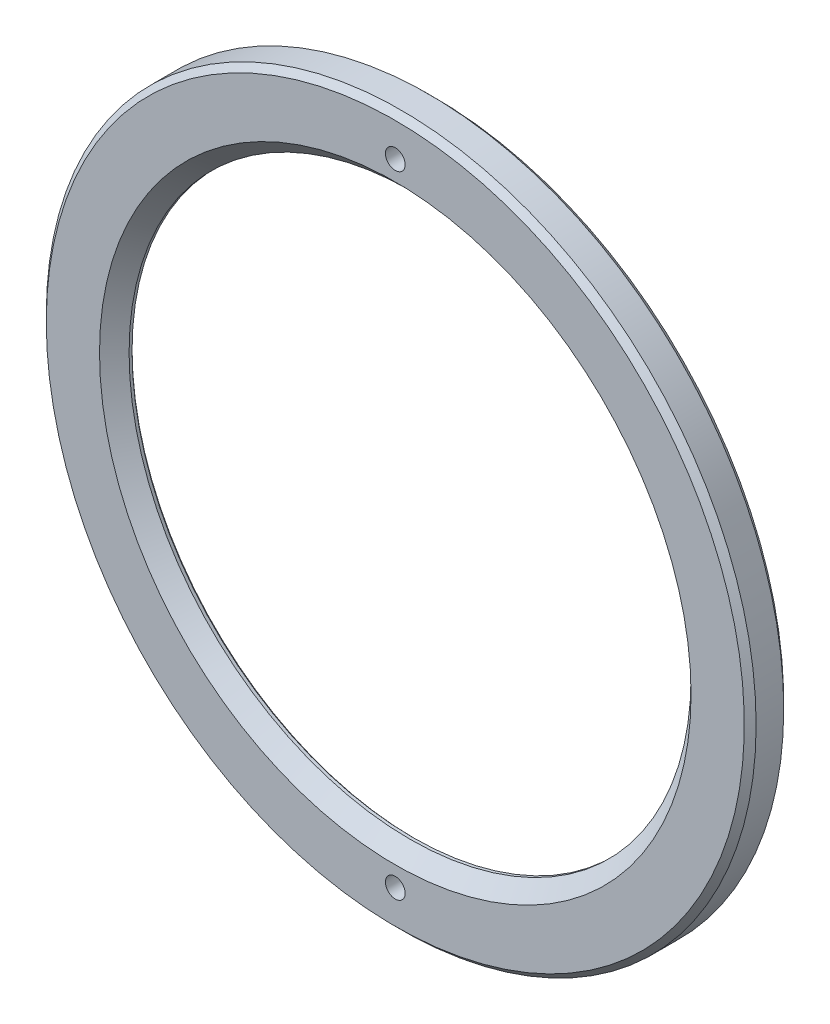
ISO-10303-21;
HEADER;
FILE_DESCRIPTION(('STEP AP214'),'2;1');
FILE_NAME('part.step','',(''),(''),'','','');
FILE_SCHEMA(('AUTOMOTIVE_DESIGN { 1 0 10303 214 1 1 1 1 }'));
ENDSEC;
DATA;
#1=APPLICATION_CONTEXT('core data for automotive mechanical design processes');
#2=APPLICATION_PROTOCOL_DEFINITION('international standard','automotive_design',2000,#1);
#3=PRODUCT_CONTEXT('',#1,'mechanical');
#4=PRODUCT('Part','Part','',(#3));
#5=PRODUCT_RELATED_PRODUCT_CATEGORY('part','',(#4));
#6=PRODUCT_DEFINITION_FORMATION('','',#4);
#7=PRODUCT_DEFINITION_CONTEXT('part definition',#1,'design');
#8=PRODUCT_DEFINITION('design','',#6,#7);
#9=PRODUCT_DEFINITION_SHAPE('','',#8);
#10=(LENGTH_UNIT() NAMED_UNIT(*) SI_UNIT(.MILLI.,.METRE.));
#11=(NAMED_UNIT(*) PLANE_ANGLE_UNIT() SI_UNIT($,.RADIAN.));
#12=(NAMED_UNIT(*) SI_UNIT($,.STERADIAN.) SOLID_ANGLE_UNIT());
#13=UNCERTAINTY_MEASURE_WITH_UNIT(LENGTH_MEASURE(1.E-05),#10,'distance_accuracy_value','');
#14=(GEOMETRIC_REPRESENTATION_CONTEXT(3) GLOBAL_UNCERTAINTY_ASSIGNED_CONTEXT((#13)) GLOBAL_UNIT_ASSIGNED_CONTEXT((#10,
#11,#12)) REPRESENTATION_CONTEXT('',''));
#15=CARTESIAN_POINT('',(0.,0.,0.));
#16=DIRECTION('',(0.,0.,1.));
#17=DIRECTION('',(1.,0.,0.));
#18=AXIS2_PLACEMENT_3D('',#15,#16,#17);
#19=CARTESIAN_POINT('',(0.,0.,26.7051514597408));
#20=DIRECTION('',(0.,0.,1.));
#21=DIRECTION('',(1.,0.,0.));
#22=AXIS2_PLACEMENT_3D('',#19,#20,#21);
#23=PLANE('',#22);
#24=CARTESIAN_POINT('',(0.,0.,26.7051514597408));
#25=DIRECTION('',(0.,0.,1.));
#26=DIRECTION('',(1.,0.,0.));
#27=AXIS2_PLACEMENT_3D('',#24,#25,#26);
#28=CIRCLE('',#27,16.95);
#29=CARTESIAN_POINT('',(-16.95,0.,26.7051514597408));
#30=VERTEX_POINT('',#29);
#31=EDGE_CURVE('E121',#30,#30,#28,.T.);
#32=ORIENTED_EDGE('',*,*,#31,.T.);
#33=EDGE_LOOP('',(#32));
#34=FACE_BOUND('',#33,.T.);
#35=CARTESIAN_POINT('',(0.,0.,26.7051514597408));
#36=DIRECTION('',(0.,0.,1.));
#37=DIRECTION('',(1.,0.,0.));
#38=AXIS2_PLACEMENT_3D('',#35,#36,#37);
#39=CIRCLE('',#38,17.7);
#40=CARTESIAN_POINT('',(-17.7,0.,26.7051514597408));
#41=VERTEX_POINT('',#40);
#42=EDGE_CURVE('E11',#41,#41,#39,.T.);
#43=ORIENTED_EDGE('',*,*,#42,.F.);
#44=EDGE_LOOP('',(#43));
#45=FACE_BOUND('',#44,.T.);
#46=ADVANCED_FACE('F16',(#34,#45),#23,.F.);
#47=CARTESIAN_POINT('',(0.,0.,27.7051514597408));
#48=DIRECTION('',(0.,0.,1.));
#49=DIRECTION('',(1.,0.,0.));
#50=AXIS2_PLACEMENT_3D('',#47,#48,#49);
#51=PLANE('',#50);
#52=CARTESIAN_POINT('',(0.,0.,27.7051514597408));
#53=DIRECTION('',(0.,0.,1.));
#54=DIRECTION('',(1.,0.,0.));
#55=AXIS2_PLACEMENT_3D('',#52,#53,#54);
#56=CIRCLE('',#55,14.35);
#57=CARTESIAN_POINT('',(-14.35,0.,27.7051514597408));
#58=VERTEX_POINT('',#57);
#59=EDGE_CURVE('E113',#58,#58,#56,.T.);
#60=ORIENTED_EDGE('',*,*,#59,.T.);
#61=EDGE_LOOP('',(#60));
#62=FACE_BOUND('',#61,.T.);
#63=CARTESIAN_POINT('',(0.,16.,27.7051514597408));
#64=DIRECTION('',(0.,0.,1.));
#65=DIRECTION('',(1.,0.,0.));
#66=AXIS2_PLACEMENT_3D('',#63,#64,#65);
#67=CIRCLE('',#66,0.5);
#68=CARTESIAN_POINT('',(0.5,16.,27.7051514597408));
#69=VERTEX_POINT('',#68);
#70=EDGE_CURVE('E129',#69,#69,#67,.T.);
#71=ORIENTED_EDGE('',*,*,#70,.T.);
#72=EDGE_LOOP('',(#71));
#73=FACE_BOUND('',#72,.T.);
#74=CARTESIAN_POINT('',(0.,-16.,27.7051514597408));
#75=DIRECTION('',(0.,0.,-1.));
#76=DIRECTION('',(1.,0.,0.));
#77=AXIS2_PLACEMENT_3D('',#74,#75,#76);
#78=CIRCLE('',#77,0.5);
#79=CARTESIAN_POINT('',(-0.5,-16.,27.7051514597408));
#80=VERTEX_POINT('',#79);
#81=EDGE_CURVE('E116',#80,#80,#78,.T.);
#82=ORIENTED_EDGE('',*,*,#81,.F.);
#83=EDGE_LOOP('',(#82));
#84=FACE_BOUND('',#83,.T.);
#85=CARTESIAN_POINT('',(0.,0.,27.7051514597408));
#86=DIRECTION('',(0.,0.,1.));
#87=DIRECTION('',(1.,0.,0.));
#88=AXIS2_PLACEMENT_3D('',#85,#86,#87);
#89=CIRCLE('',#88,16.75);
#90=CARTESIAN_POINT('',(16.75,0.,27.7051514597408));
#91=VERTEX_POINT('',#90);
#92=EDGE_CURVE('E105',#91,#91,#89,.T.);
#93=ORIENTED_EDGE('',*,*,#92,.F.);
#94=EDGE_LOOP('',(#93));
#95=FACE_BOUND('',#94,.T.);
#96=ADVANCED_FACE('F164',(#62,#73,#84,#95),#51,.F.);
#97=CARTESIAN_POINT('',(0.,0.,28.7051514597408));
#98=DIRECTION('',(0.,0.,-1.));
#99=DIRECTION('',(0.,-1.,0.));
#100=AXIS2_PLACEMENT_3D('',#97,#98,#99);
#101=PLANE('',#100);
#102=CARTESIAN_POINT('',(0.,0.,28.7051514597408));
#103=DIRECTION('',(0.,0.,1.));
#104=DIRECTION('',(1.,0.,0.));
#105=AXIS2_PLACEMENT_3D('',#102,#103,#104);
#106=CIRCLE('',#105,15.);
#107=CARTESIAN_POINT('',(15.,0.,28.7051514597408));
#108=VERTEX_POINT('',#107);
#109=EDGE_CURVE('E93',#108,#108,#106,.T.);
#110=ORIENTED_EDGE('',*,*,#109,.F.);
#111=EDGE_LOOP('',(#110));
#112=FACE_BOUND('',#111,.T.);
#113=CARTESIAN_POINT('',(0.,16.,28.7051514597408));
#114=DIRECTION('',(0.,0.,1.));
#115=DIRECTION('',(1.,0.,0.));
#116=AXIS2_PLACEMENT_3D('',#113,#114,#115);
#117=CIRCLE('',#116,0.5);
#118=CARTESIAN_POINT('',(0.5,16.,28.7051514597408));
#119=VERTEX_POINT('',#118);
#120=EDGE_CURVE('E122',#119,#119,#117,.T.);
#121=ORIENTED_EDGE('',*,*,#120,.F.);
#122=EDGE_LOOP('',(#121));
#123=FACE_BOUND('',#122,.T.);
#124=CARTESIAN_POINT('',(0.,-16.,28.7051514597408));
#125=DIRECTION('',(0.,0.,-1.));
#126=DIRECTION('',(1.,0.,0.));
#127=AXIS2_PLACEMENT_3D('',#124,#125,#126);
#128=CIRCLE('',#127,0.5);
#129=CARTESIAN_POINT('',(0.5,-16.,28.7051514597408));
#130=VERTEX_POINT('',#129);
#131=EDGE_CURVE('E118',#130,#130,#128,.T.);
#132=ORIENTED_EDGE('',*,*,#131,.T.);
#133=EDGE_LOOP('',(#132));
#134=FACE_BOUND('',#133,.T.);
#135=CARTESIAN_POINT('',(0.,0.,28.7051514597408));
#136=DIRECTION('',(0.,0.,1.));
#137=DIRECTION('',(1.,0.,0.));
#138=AXIS2_PLACEMENT_3D('',#135,#136,#137);
#139=CIRCLE('',#138,17.7);
#140=CARTESIAN_POINT('',(-17.7,0.,28.7051514597408));
#141=VERTEX_POINT('',#140);
#142=EDGE_CURVE('E20',#141,#141,#139,.T.);
#143=ORIENTED_EDGE('',*,*,#142,.T.);
#144=EDGE_LOOP('',(#143));
#145=FACE_BOUND('',#144,.T.);
#146=ADVANCED_FACE('F170',(#112,#123,#134,#145),#101,.F.);
#147=CARTESIAN_POINT('',(0.,0.,27.0051514597408));
#148=DIRECTION('',(0.,0.,1.));
#149=DIRECTION('',(1.,0.,0.));
#150=AXIS2_PLACEMENT_3D('',#147,#148,#149);
#151=CONICAL_SURFACE('',#150,18.,0.785398163397443);
#152=CARTESIAN_POINT('',(0.,0.,27.0051514597408));
#153=DIRECTION('',(0.,0.,1.));
#154=DIRECTION('',(1.,0.,0.));
#155=AXIS2_PLACEMENT_3D('',#152,#153,#154);
#156=CIRCLE('',#155,18.);
#157=CARTESIAN_POINT('',(-18.,0.,27.0051514597408));
#158=VERTEX_POINT('',#157);
#159=EDGE_CURVE('E27',#158,#158,#156,.T.);
#160=ORIENTED_EDGE('',*,*,#159,.F.);
#161=EDGE_LOOP('',(#160));
#162=FACE_BOUND('',#161,.T.);
#163=ORIENTED_EDGE('',*,*,#42,.T.);
#164=EDGE_LOOP('',(#163));
#165=FACE_BOUND('',#164,.T.);
#166=ADVANCED_FACE('F175',(#162,#165),#151,.T.);
#167=CARTESIAN_POINT('',(0.,0.,32.8461321952924));
#168=DIRECTION('',(0.,0.,1.));
#169=DIRECTION('',(1.,0.,0.));
#170=AXIS2_PLACEMENT_3D('',#167,#168,#169);
#171=CYLINDRICAL_SURFACE('',#170,18.);
#172=CARTESIAN_POINT('',(0.,0.,28.4051514597408));
#173=DIRECTION('',(0.,0.,1.));
#174=DIRECTION('',(1.,0.,0.));
#175=AXIS2_PLACEMENT_3D('',#172,#173,#174);
#176=CIRCLE('',#175,18.);
#177=CARTESIAN_POINT('',(-18.,0.,28.4051514597408));
#178=VERTEX_POINT('',#177);
#179=EDGE_CURVE('E132',#178,#178,#176,.T.);
#180=ORIENTED_EDGE('',*,*,#179,.F.);
#181=EDGE_LOOP('',(#180));
#182=FACE_BOUND('',#181,.T.);
#183=ORIENTED_EDGE('',*,*,#159,.T.);
#184=EDGE_LOOP('',(#183));
#185=FACE_BOUND('',#184,.T.);
#186=ADVANCED_FACE('F184',(#182,#185),#171,.T.);
#187=CARTESIAN_POINT('',(0.,0.,28.7051514597408));
#188=DIRECTION('',(0.,0.,-1.));
#189=DIRECTION('',(-1.,0.,0.));
#190=AXIS2_PLACEMENT_3D('',#187,#188,#189);
#191=CONICAL_SURFACE('',#190,17.7,0.785398163397443);
#192=ORIENTED_EDGE('',*,*,#179,.T.);
#193=EDGE_LOOP('',(#192));
#194=FACE_BOUND('',#193,.T.);
#195=ORIENTED_EDGE('',*,*,#142,.F.);
#196=EDGE_LOOP('',(#195));
#197=FACE_BOUND('',#196,.T.);
#198=ADVANCED_FACE('F201',(#194,#197),#191,.T.);
#199=CARTESIAN_POINT('',(0.,0.,28.7051514597408));
#200=DIRECTION('',(0.,0.,1.));
#201=DIRECTION('',(1.,0.,0.));
#202=AXIS2_PLACEMENT_3D('',#199,#200,#201);
#203=CONICAL_SURFACE('',#202,15.,0.78539816339745);
#204=ORIENTED_EDGE('',*,*,#109,.T.);
#205=EDGE_LOOP('',(#204));
#206=FACE_BOUND('',#205,.T.);
#207=CARTESIAN_POINT('',(0.,0.,27.9551514597408));
#208=DIRECTION('',(0.,0.,1.));
#209=DIRECTION('',(1.,0.,0.));
#210=AXIS2_PLACEMENT_3D('',#207,#208,#209);
#211=CIRCLE('',#210,14.25);
#212=CARTESIAN_POINT('',(14.25,0.,27.9551514597408));
#213=VERTEX_POINT('',#212);
#214=EDGE_CURVE('E100',#213,#213,#211,.T.);
#215=ORIENTED_EDGE('',*,*,#214,.F.);
#216=EDGE_LOOP('',(#215));
#217=FACE_BOUND('',#216,.T.);
#218=ADVANCED_FACE('F178',(#206,#217),#203,.F.);
#219=CARTESIAN_POINT('',(0.,0.,32.8461321952924));
#220=DIRECTION('',(0.,0.,1.));
#221=DIRECTION('',(1.,0.,0.));
#222=AXIS2_PLACEMENT_3D('',#219,#220,#221);
#223=CYLINDRICAL_SURFACE('',#222,14.25);
#224=ORIENTED_EDGE('',*,*,#214,.T.);
#225=EDGE_LOOP('',(#224));
#226=FACE_BOUND('',#225,.T.);
#227=CARTESIAN_POINT('',(0.,0.,27.8051514597408));
#228=DIRECTION('',(0.,0.,-1.));
#229=DIRECTION('',(1.,0.,0.));
#230=AXIS2_PLACEMENT_3D('',#227,#228,#229);
#231=CIRCLE('',#230,14.25);
#232=CARTESIAN_POINT('',(-14.25,0.,27.8051514597408));
#233=VERTEX_POINT('',#232);
#234=EDGE_CURVE('E126',#233,#233,#231,.T.);
#235=ORIENTED_EDGE('',*,*,#234,.T.);
#236=EDGE_LOOP('',(#235));
#237=FACE_BOUND('',#236,.T.);
#238=ADVANCED_FACE('F101',(#226,#237),#223,.F.);
#239=CARTESIAN_POINT('',(0.,0.,32.8461321952924));
#240=DIRECTION('',(0.,0.,1.));
#241=DIRECTION('',(1.,0.,0.));
#242=AXIS2_PLACEMENT_3D('',#239,#240,#241);
#243=CYLINDRICAL_SURFACE('',#242,16.75);
#244=ORIENTED_EDGE('',*,*,#92,.T.);
#245=EDGE_LOOP('',(#244));
#246=FACE_BOUND('',#245,.T.);
#247=CARTESIAN_POINT('',(0.,0.,26.9051514597408));
#248=DIRECTION('',(0.,0.,-1.));
#249=DIRECTION('',(1.,0.,0.));
#250=AXIS2_PLACEMENT_3D('',#247,#248,#249);
#251=CIRCLE('',#250,16.75);
#252=CARTESIAN_POINT('',(-16.75,0.,26.9051514597408));
#253=VERTEX_POINT('',#252);
#254=EDGE_CURVE('E119',#253,#253,#251,.T.);
#255=ORIENTED_EDGE('',*,*,#254,.T.);
#256=EDGE_LOOP('',(#255));
#257=FACE_BOUND('',#256,.T.);
#258=ADVANCED_FACE('F149',(#246,#257),#243,.F.);
#259=CARTESIAN_POINT('',(0.,0.,27.7051514597408));
#260=DIRECTION('',(0.,0.,-1.));
#261=DIRECTION('',(-1.,0.,0.));
#262=AXIS2_PLACEMENT_3D('',#259,#260,#261);
#263=CONICAL_SURFACE('',#262,14.35,0.78539816339744);
#264=ORIENTED_EDGE('',*,*,#59,.F.);
#265=EDGE_LOOP('',(#264));
#266=FACE_BOUND('',#265,.T.);
#267=ORIENTED_EDGE('',*,*,#234,.F.);
#268=EDGE_LOOP('',(#267));
#269=FACE_BOUND('',#268,.T.);
#270=ADVANCED_FACE('F146',(#266,#269),#263,.F.);
#271=CARTESIAN_POINT('',(0.,0.,26.7051514597408));
#272=DIRECTION('',(0.,0.,-1.));
#273=DIRECTION('',(-1.,0.,0.));
#274=AXIS2_PLACEMENT_3D('',#271,#272,#273);
#275=CONICAL_SURFACE('',#274,16.95,0.785398163397448);
#276=ORIENTED_EDGE('',*,*,#31,.F.);
#277=EDGE_LOOP('',(#276));
#278=FACE_BOUND('',#277,.T.);
#279=ORIENTED_EDGE('',*,*,#254,.F.);
#280=EDGE_LOOP('',(#279));
#281=FACE_BOUND('',#280,.T.);
#282=ADVANCED_FACE('F148',(#278,#281),#275,.F.);
#283=CARTESIAN_POINT('',(0.,16.,18.7051514597408));
#284=DIRECTION('',(0.,0.,1.));
#285=DIRECTION('',(1.,0.,0.));
#286=AXIS2_PLACEMENT_3D('',#283,#284,#285);
#287=CYLINDRICAL_SURFACE('',#286,0.5);
#288=ORIENTED_EDGE('',*,*,#120,.T.);
#289=EDGE_LOOP('',(#288));
#290=FACE_BOUND('',#289,.T.);
#291=ORIENTED_EDGE('',*,*,#70,.F.);
#292=EDGE_LOOP('',(#291));
#293=FACE_BOUND('',#292,.T.);
#294=ADVANCED_FACE('F18',(#290,#293),#287,.F.);
#295=CARTESIAN_POINT('',(0.,-16.,18.7051514597408));
#296=DIRECTION('',(0.,0.,1.));
#297=DIRECTION('',(1.,0.,0.));
#298=AXIS2_PLACEMENT_3D('',#295,#296,#297);
#299=CYLINDRICAL_SURFACE('',#298,0.5);
#300=ORIENTED_EDGE('',*,*,#131,.F.);
#301=EDGE_LOOP('',(#300));
#302=FACE_BOUND('',#301,.T.);
#303=ORIENTED_EDGE('',*,*,#81,.T.);
#304=EDGE_LOOP('',(#303));
#305=FACE_BOUND('',#304,.T.);
#306=ADVANCED_FACE('F237',(#302,#305),#299,.F.);
#307=CLOSED_SHELL('',(#46,#96,#146,#166,#186,#198,#218,#238,#258,#270,#282,#294,#306));
#308=MANIFOLD_SOLID_BREP('B1',#307);
#309=ADVANCED_BREP_SHAPE_REPRESENTATION('',(#18,#308),#14);
#310=SHAPE_DEFINITION_REPRESENTATION(#9,#309);
ENDSEC;
END-ISO-10303-21;
